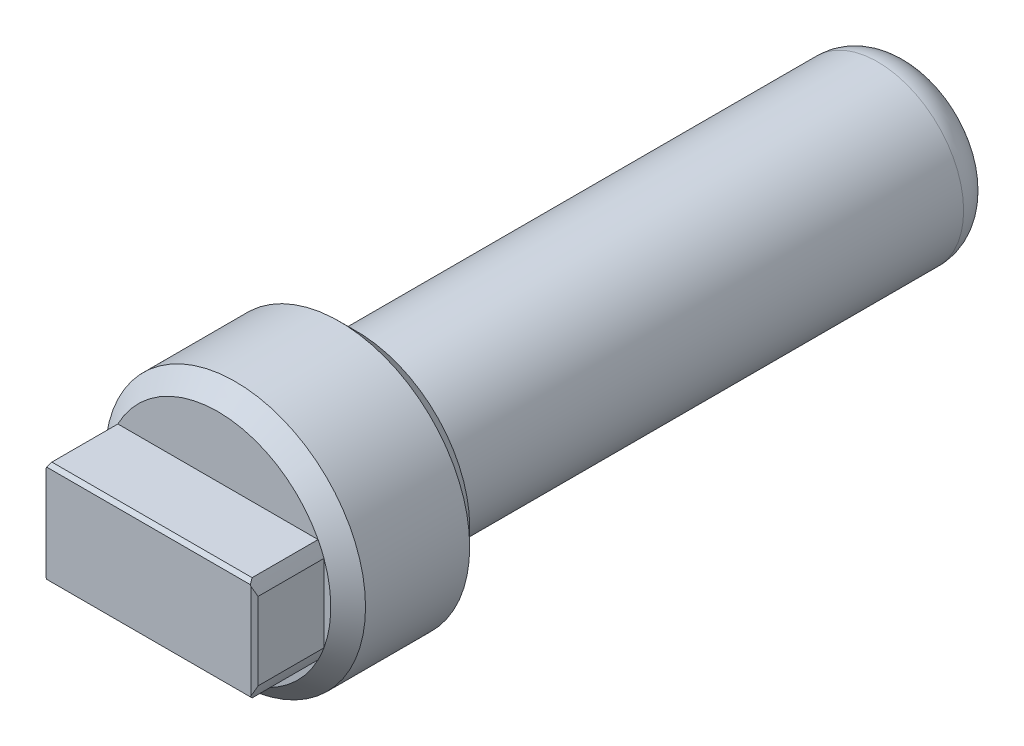
ISO-10303-21;
HEADER;
FILE_DESCRIPTION(('STEP AP214'),'2;1');
FILE_NAME('part.step','',(''),(''),'','','');
FILE_SCHEMA(('AUTOMOTIVE_DESIGN { 1 0 10303 214 1 1 1 1 }'));
ENDSEC;
DATA;
#1=APPLICATION_CONTEXT('core data for automotive mechanical design processes');
#2=APPLICATION_PROTOCOL_DEFINITION('international standard','automotive_design',2000,#1);
#3=PRODUCT_CONTEXT('',#1,'mechanical');
#4=PRODUCT('Part','Part','',(#3));
#5=PRODUCT_RELATED_PRODUCT_CATEGORY('part','',(#4));
#6=PRODUCT_DEFINITION_FORMATION('','',#4);
#7=PRODUCT_DEFINITION_CONTEXT('part definition',#1,'design');
#8=PRODUCT_DEFINITION('design','',#6,#7);
#9=PRODUCT_DEFINITION_SHAPE('','',#8);
#10=(LENGTH_UNIT() NAMED_UNIT(*) SI_UNIT(.MILLI.,.METRE.));
#11=(NAMED_UNIT(*) PLANE_ANGLE_UNIT() SI_UNIT($,.RADIAN.));
#12=(NAMED_UNIT(*) SI_UNIT($,.STERADIAN.) SOLID_ANGLE_UNIT());
#13=UNCERTAINTY_MEASURE_WITH_UNIT(LENGTH_MEASURE(1.E-05),#10,'distance_accuracy_value','');
#14=(GEOMETRIC_REPRESENTATION_CONTEXT(3) GLOBAL_UNCERTAINTY_ASSIGNED_CONTEXT((#13)) GLOBAL_UNIT_ASSIGNED_CONTEXT((#10,
#11,#12)) REPRESENTATION_CONTEXT('',''));
#15=CARTESIAN_POINT('',(0.,0.,0.));
#16=DIRECTION('',(0.,0.,1.));
#17=DIRECTION('',(1.,0.,0.));
#18=AXIS2_PLACEMENT_3D('',#15,#16,#17);
#19=CARTESIAN_POINT('',(0.,0.,20.));
#20=DIRECTION('',(0.,0.,1.));
#21=DIRECTION('',(1.,0.,0.));
#22=AXIS2_PLACEMENT_3D('',#19,#20,#21);
#23=PLANE('',#22);
#24=CARTESIAN_POINT('',(0.,0.,20.));
#25=DIRECTION('',(0.,0.,1.));
#26=DIRECTION('',(1.,0.,0.));
#27=AXIS2_PLACEMENT_3D('',#24,#25,#26);
#28=CIRCLE('',#27,3.24999999999999);
#29=CARTESIAN_POINT('',(-3.05263006031999,1.11532493688194,20.));
#30=VERTEX_POINT('',#29);
#31=CARTESIAN_POINT('',(-3.05263006031999,-1.11532493688194,20.));
#32=VERTEX_POINT('',#31);
#33=EDGE_CURVE('E230',#30,#32,#28,.T.);
#34=ORIENTED_EDGE('',*,*,#33,.T.);
#35=DIRECTION('',(0.,1.,0.));
#36=VECTOR('',#35,1.);
#37=CARTESIAN_POINT('',(-3.05263006031999,0.,20.));
#38=LINE('',#37,#36);
#39=EDGE_CURVE('E330',#32,#30,#38,.T.);
#40=ORIENTED_EDGE('',*,*,#39,.T.);
#41=EDGE_LOOP('',(#34,#40));
#42=FACE_BOUND('',#41,.T.);
#43=ADVANCED_FACE('F35',(#42),#23,.T.);
#44=CARTESIAN_POINT('',(2.88314064866769,1.5,20.));
#45=VERTEX_POINT('',#44);
#46=CARTESIAN_POINT('',(-2.88314064866769,1.5,20.));
#47=VERTEX_POINT('',#46);
#48=EDGE_CURVE('E149',#45,#47,#28,.T.);
#49=ORIENTED_EDGE('',*,*,#48,.T.);
#50=DIRECTION('',(1.,0.,0.));
#51=VECTOR('',#50,1.);
#52=CARTESIAN_POINT('',(0.,1.5,20.));
#53=LINE('',#52,#51);
#54=EDGE_CURVE('E161',#47,#45,#53,.T.);
#55=ORIENTED_EDGE('',*,*,#54,.T.);
#56=EDGE_LOOP('',(#49,#55));
#57=FACE_BOUND('',#56,.T.);
#58=ADVANCED_FACE('F242',(#57),#23,.T.);
#59=DIRECTION('',(1.,0.,0.));
#60=VECTOR('',#59,1.);
#61=CARTESIAN_POINT('',(0.,-1.5,20.));
#62=LINE('',#61,#60);
#63=CARTESIAN_POINT('',(-2.88314064866769,-1.5,20.));
#64=VERTEX_POINT('',#63);
#65=CARTESIAN_POINT('',(2.88314064866769,-1.5,20.));
#66=VERTEX_POINT('',#65);
#67=EDGE_CURVE('E205',#64,#66,#62,.T.);
#68=ORIENTED_EDGE('',*,*,#67,.F.);
#69=EDGE_CURVE('E156',#64,#66,#28,.T.);
#70=ORIENTED_EDGE('',*,*,#69,.T.);
#71=EDGE_LOOP('',(#68,#70));
#72=FACE_BOUND('',#71,.T.);
#73=ADVANCED_FACE('F306',(#72),#23,.T.);
#74=CARTESIAN_POINT('',(0.,0.,16.));
#75=DIRECTION('',(0.,0.,-1.));
#76=DIRECTION('',(-1.,0.,0.));
#77=AXIS2_PLACEMENT_3D('',#74,#75,#76);
#78=CYLINDRICAL_SURFACE('',#77,2.475);
#79=CARTESIAN_POINT('',(0.,0.,1.));
#80=DIRECTION('',(0.,0.,1.));
#81=DIRECTION('',(1.,0.,0.));
#82=AXIS2_PLACEMENT_3D('',#79,#80,#81);
#83=CIRCLE('',#82,2.475);
#84=CARTESIAN_POINT('',(2.475,0.,1.));
#85=VERTEX_POINT('',#84);
#86=EDGE_CURVE('E43',#85,#85,#83,.T.);
#87=ORIENTED_EDGE('',*,*,#86,.T.);
#88=EDGE_LOOP('',(#87));
#89=FACE_BOUND('',#88,.T.);
#90=CARTESIAN_POINT('',(0.,0.,16.));
#91=DIRECTION('',(0.,0.,1.));
#92=DIRECTION('',(1.,0.,0.));
#93=AXIS2_PLACEMENT_3D('',#90,#91,#92);
#94=CIRCLE('',#93,2.475);
#95=CARTESIAN_POINT('',(2.475,0.,16.));
#96=VERTEX_POINT('',#95);
#97=EDGE_CURVE('E201',#96,#96,#94,.T.);
#98=ORIENTED_EDGE('',*,*,#97,.F.);
#99=EDGE_LOOP('',(#98));
#100=FACE_BOUND('',#99,.T.);
#101=ADVANCED_FACE('F291',(#89,#100),#78,.T.);
#102=CARTESIAN_POINT('',(0.,0.,0.));
#103=DIRECTION('',(0.,0.,1.));
#104=DIRECTION('',(1.,0.,0.));
#105=AXIS2_PLACEMENT_3D('',#102,#103,#104);
#106=PLANE('',#105);
#107=CARTESIAN_POINT('',(0.,0.,0.));
#108=DIRECTION('',(0.,0.,1.));
#109=DIRECTION('',(1.,0.,0.));
#110=AXIS2_PLACEMENT_3D('',#107,#108,#109);
#111=CIRCLE('',#110,1.475);
#112=CARTESIAN_POINT('',(1.475,0.,0.));
#113=VERTEX_POINT('',#112);
#114=EDGE_CURVE('E11',#113,#113,#111,.F.);
#115=ORIENTED_EDGE('',*,*,#114,.T.);
#116=EDGE_LOOP('',(#115));
#117=FACE_BOUND('',#116,.T.);
#118=ADVANCED_FACE('F318',(#117),#106,.F.);
#119=CARTESIAN_POINT('',(0.,0.,20.));
#120=DIRECTION('',(0.,0.,-1.));
#121=DIRECTION('',(-1.,0.,0.));
#122=AXIS2_PLACEMENT_3D('',#119,#120,#121);
#123=CYLINDRICAL_SURFACE('',#122,3.75);
#124=CARTESIAN_POINT('',(0.,0.,16.5));
#125=DIRECTION('',(0.,0.,1.));
#126=DIRECTION('',(1.,0.,0.));
#127=AXIS2_PLACEMENT_3D('',#124,#125,#126);
#128=CIRCLE('',#127,3.75);
#129=CARTESIAN_POINT('',(3.75,0.,16.5));
#130=VERTEX_POINT('',#129);
#131=EDGE_CURVE('E219',#130,#130,#128,.T.);
#132=ORIENTED_EDGE('',*,*,#131,.T.);
#133=EDGE_LOOP('',(#132));
#134=FACE_BOUND('',#133,.T.);
#135=CARTESIAN_POINT('',(0.,0.,19.5));
#136=DIRECTION('',(0.,0.,1.));
#137=DIRECTION('',(1.,0.,0.));
#138=AXIS2_PLACEMENT_3D('',#135,#136,#137);
#139=CIRCLE('',#138,3.75);
#140=CARTESIAN_POINT('',(3.75,0.,19.5));
#141=VERTEX_POINT('',#140);
#142=EDGE_CURVE('E216',#141,#141,#139,.F.);
#143=ORIENTED_EDGE('',*,*,#142,.T.);
#144=EDGE_LOOP('',(#143));
#145=FACE_BOUND('',#144,.T.);
#146=ADVANCED_FACE('F311',(#134,#145),#123,.T.);
#147=DIRECTION('',(0.,1.,0.));
#148=VECTOR('',#147,1.);
#149=CARTESIAN_POINT('',(3.05263006031999,0.,20.));
#150=LINE('',#149,#148);
#151=CARTESIAN_POINT('',(3.05263006031999,-1.11532493688194,20.));
#152=VERTEX_POINT('',#151);
#153=CARTESIAN_POINT('',(3.05263006031999,1.11532493688194,20.));
#154=VERTEX_POINT('',#153);
#155=EDGE_CURVE('E155',#152,#154,#150,.T.);
#156=ORIENTED_EDGE('',*,*,#155,.F.);
#157=EDGE_CURVE('E145',#152,#154,#28,.T.);
#158=ORIENTED_EDGE('',*,*,#157,.T.);
#159=EDGE_LOOP('',(#156,#158));
#160=FACE_BOUND('',#159,.T.);
#161=ADVANCED_FACE('F154',(#160),#23,.T.);
#162=CARTESIAN_POINT('',(0.,0.,16.));
#163=DIRECTION('',(0.,0.,1.));
#164=DIRECTION('',(1.,0.,0.));
#165=AXIS2_PLACEMENT_3D('',#162,#163,#164);
#166=PLANE('',#165);
#167=CARTESIAN_POINT('',(0.,0.,16.));
#168=DIRECTION('',(0.,0.,1.));
#169=DIRECTION('',(1.,0.,0.));
#170=AXIS2_PLACEMENT_3D('',#167,#168,#169);
#171=CIRCLE('',#170,3.24999999999999);
#172=CARTESIAN_POINT('',(3.24999999999999,0.,16.));
#173=VERTEX_POINT('',#172);
#174=EDGE_CURVE('E157',#173,#173,#171,.F.);
#175=ORIENTED_EDGE('',*,*,#174,.T.);
#176=EDGE_LOOP('',(#175));
#177=FACE_BOUND('',#176,.T.);
#178=ORIENTED_EDGE('',*,*,#97,.T.);
#179=EDGE_LOOP('',(#178));
#180=FACE_BOUND('',#179,.T.);
#181=ADVANCED_FACE('F310',(#177,#180),#166,.F.);
#182=CARTESIAN_POINT('',(0.,0.,16.5));
#183=DIRECTION('',(0.,0.,1.));
#184=DIRECTION('',(1.,0.,0.));
#185=AXIS2_PLACEMENT_3D('',#182,#183,#184);
#186=CONICAL_SURFACE('',#185,3.75,0.785398163397454);
#187=ORIENTED_EDGE('',*,*,#174,.F.);
#188=EDGE_LOOP('',(#187));
#189=FACE_BOUND('',#188,.T.);
#190=ORIENTED_EDGE('',*,*,#131,.F.);
#191=EDGE_LOOP('',(#190));
#192=FACE_BOUND('',#191,.T.);
#193=ADVANCED_FACE('F316',(#189,#192),#186,.T.);
#194=CARTESIAN_POINT('',(0.,0.,20.));
#195=DIRECTION('',(0.,0.,-1.));
#196=DIRECTION('',(-1.,0.,0.));
#197=AXIS2_PLACEMENT_3D('',#194,#195,#196);
#198=CONICAL_SURFACE('',#197,3.24999999999999,0.785398163397449);
#199=ORIENTED_EDGE('',*,*,#142,.F.);
#200=EDGE_LOOP('',(#199));
#201=FACE_BOUND('',#200,.T.);
#202=EDGE_CURVE('E131',#154,#45,#28,.T.);
#203=ORIENTED_EDGE('',*,*,#202,.F.);
#204=ORIENTED_EDGE('',*,*,#157,.F.);
#205=CARTESIAN_POINT('',(0.,0.,20.));
#206=DIRECTION('',(0.,0.,1.));
#207=DIRECTION('',(1.,0.,0.));
#208=AXIS2_PLACEMENT_3D('',#205,#206,#207);
#209=CIRCLE('',#208,3.24999999999999);
#210=EDGE_CURVE('E162',#66,#152,#209,.T.);
#211=ORIENTED_EDGE('',*,*,#210,.F.);
#212=ORIENTED_EDGE('',*,*,#69,.F.);
#213=EDGE_CURVE('E209',#32,#64,#209,.T.);
#214=ORIENTED_EDGE('',*,*,#213,.F.);
#215=ORIENTED_EDGE('',*,*,#33,.F.);
#216=EDGE_CURVE('E165',#47,#30,#209,.T.);
#217=ORIENTED_EDGE('',*,*,#216,.F.);
#218=ORIENTED_EDGE('',*,*,#48,.F.);
#219=EDGE_LOOP('',(#203,#204,#211,#212,#214,#215,#217,#218));
#220=FACE_BOUND('',#219,.T.);
#221=ADVANCED_FACE('F143',(#201,#220),#198,.T.);
#222=CARTESIAN_POINT('',(0.,0.,22.));
#223=DIRECTION('',(0.,0.,-1.));
#224=DIRECTION('',(-1.,0.,0.));
#225=AXIS2_PLACEMENT_3D('',#222,#223,#224);
#226=CYLINDRICAL_SURFACE('',#225,3.24999999999999);
#227=DIRECTION('',(0.,0.,-1.));
#228=VECTOR('',#227,1.);
#229=CARTESIAN_POINT('',(3.05263006031999,-1.11532493688194,22.));
#230=LINE('',#229,#228);
#231=CARTESIAN_POINT('',(3.05263006031999,-1.11532493688194,21.9));
#232=VERTEX_POINT('',#231);
#233=EDGE_CURVE('E136',#232,#152,#230,.T.);
#234=ORIENTED_EDGE('',*,*,#233,.F.);
#235=CARTESIAN_POINT('',(0.,0.,24.9526300603199));
#236=DIRECTION('',(0.707106781186535,0.,0.70710678118656));
#237=DIRECTION('',(0.70710678118656,0.,-0.707106781186535));
#238=AXIS2_PLACEMENT_3D('',#235,#236,#237);
#239=ELLIPSE('',#238,4.59619407771247,3.24999999999999);
#240=CARTESIAN_POINT('',(2.95263006031999,-1.3581147694119,22.));
#241=VERTEX_POINT('',#240);
#242=EDGE_CURVE('E342',#232,#241,#239,.F.);
#243=ORIENTED_EDGE('',*,*,#242,.T.);
#244=CARTESIAN_POINT('',(0.,0.,22.));
#245=DIRECTION('',(0.,0.,1.));
#246=DIRECTION('',(1.,0.,0.));
#247=AXIS2_PLACEMENT_3D('',#244,#245,#246);
#248=CIRCLE('',#247,3.24999999999999);
#249=CARTESIAN_POINT('',(2.93300187521249,-1.39999999999999,22.));
#250=VERTEX_POINT('',#249);
#251=EDGE_CURVE('E208',#250,#241,#248,.T.);
#252=ORIENTED_EDGE('',*,*,#251,.F.);
#253=CARTESIAN_POINT('',(0.,0.,23.3999999999999));
#254=DIRECTION('',(0.,-0.707106781186535,0.70710678118656));
#255=DIRECTION('',(0.,-0.70710678118656,-0.707106781186535));
#256=AXIS2_PLACEMENT_3D('',#253,#254,#255);
#257=ELLIPSE('',#256,4.59619407771247,3.24999999999999);
#258=CARTESIAN_POINT('',(2.88314064866769,-1.5,21.9));
#259=VERTEX_POINT('',#258);
#260=EDGE_CURVE('E378',#250,#259,#257,.F.);
#261=ORIENTED_EDGE('',*,*,#260,.T.);
#262=DIRECTION('',(0.,0.,-1.));
#263=VECTOR('',#262,1.);
#264=CARTESIAN_POINT('',(2.88314064866769,-1.5,22.));
#265=LINE('',#264,#263);
#266=EDGE_CURVE('E277',#259,#66,#265,.T.);
#267=ORIENTED_EDGE('',*,*,#266,.T.);
#268=ORIENTED_EDGE('',*,*,#210,.T.);
#269=EDGE_LOOP('',(#234,#243,#252,#261,#267,#268));
#270=FACE_BOUND('',#269,.T.);
#271=ADVANCED_FACE('F360',(#270),#226,.T.);
#272=CARTESIAN_POINT('',(3.05263006031999,0.,22.));
#273=DIRECTION('',(-1.,0.,0.));
#274=DIRECTION('',(0.,0.,1.));
#275=AXIS2_PLACEMENT_3D('',#272,#273,#274);
#276=PLANE('',#275);
#277=DIRECTION('',(0.,0.,-1.));
#278=VECTOR('',#277,1.);
#279=CARTESIAN_POINT('',(3.05263006031999,1.11532493688194,22.));
#280=LINE('',#279,#278);
#281=CARTESIAN_POINT('',(3.05263006031999,1.11532493688194,21.9));
#282=VERTEX_POINT('',#281);
#283=EDGE_CURVE('E126',#282,#154,#280,.T.);
#284=ORIENTED_EDGE('',*,*,#283,.F.);
#285=DIRECTION('',(0.,-1.,0.));
#286=VECTOR('',#285,1.);
#287=CARTESIAN_POINT('',(3.05263006031999,-1.11532493688194,21.9));
#288=LINE('',#287,#286);
#289=EDGE_CURVE('E199',#282,#232,#288,.T.);
#290=ORIENTED_EDGE('',*,*,#289,.T.);
#291=ORIENTED_EDGE('',*,*,#233,.T.);
#292=ORIENTED_EDGE('',*,*,#155,.T.);
#293=EDGE_LOOP('',(#284,#290,#291,#292));
#294=FACE_BOUND('',#293,.T.);
#295=ADVANCED_FACE('F159',(#294),#276,.F.);
#296=CARTESIAN_POINT('',(2.95263006031999,1.3581147694119,22.));
#297=VERTEX_POINT('',#296);
#298=CARTESIAN_POINT('',(2.93300187521249,1.39999999999999,22.));
#299=VERTEX_POINT('',#298);
#300=EDGE_CURVE('E249',#297,#299,#248,.T.);
#301=ORIENTED_EDGE('',*,*,#300,.F.);
#302=CARTESIAN_POINT('',(0.,0.,24.9526300603199));
#303=DIRECTION('',(0.707106781186535,0.,0.70710678118656));
#304=DIRECTION('',(0.70710678118656,0.,-0.707106781186535));
#305=AXIS2_PLACEMENT_3D('',#302,#303,#304);
#306=ELLIPSE('',#305,4.59619407771247,3.24999999999999);
#307=EDGE_CURVE('E132',#297,#282,#306,.F.);
#308=ORIENTED_EDGE('',*,*,#307,.T.);
#309=ORIENTED_EDGE('',*,*,#283,.T.);
#310=ORIENTED_EDGE('',*,*,#202,.T.);
#311=DIRECTION('',(0.,0.,-1.));
#312=VECTOR('',#311,1.);
#313=CARTESIAN_POINT('',(2.88314064866769,1.5,22.));
#314=LINE('',#313,#312);
#315=CARTESIAN_POINT('',(2.88314064866769,1.5,21.9));
#316=VERTEX_POINT('',#315);
#317=EDGE_CURVE('E137',#316,#45,#314,.T.);
#318=ORIENTED_EDGE('',*,*,#317,.F.);
#319=CARTESIAN_POINT('',(0.,0.,23.4));
#320=DIRECTION('',(0.,-0.707106781186547,-0.707106781186547));
#321=DIRECTION('',(0.,0.707106781186548,-0.707106781186548));
#322=AXIS2_PLACEMENT_3D('',#319,#320,#321);
#323=ELLIPSE('',#322,4.59619407771255,3.24999999999999);
#324=EDGE_CURVE('E196',#316,#299,#323,.T.);
#325=ORIENTED_EDGE('',*,*,#324,.T.);
#326=EDGE_LOOP('',(#301,#308,#309,#310,#318,#325));
#327=FACE_BOUND('',#326,.T.);
#328=ADVANCED_FACE('F129',(#327),#226,.T.);
#329=CARTESIAN_POINT('',(0.,1.5,22.));
#330=DIRECTION('',(0.,1.,0.));
#331=DIRECTION('',(0.,0.,1.));
#332=AXIS2_PLACEMENT_3D('',#329,#330,#331);
#333=PLANE('',#332);
#334=DIRECTION('',(0.,0.,-1.));
#335=VECTOR('',#334,1.);
#336=CARTESIAN_POINT('',(-2.88314064866769,1.5,22.));
#337=LINE('',#336,#335);
#338=CARTESIAN_POINT('',(-2.88314064866769,1.5,21.9));
#339=VERTEX_POINT('',#338);
#340=EDGE_CURVE('E192',#339,#47,#337,.T.);
#341=ORIENTED_EDGE('',*,*,#340,.F.);
#342=DIRECTION('',(1.,0.,0.));
#343=VECTOR('',#342,1.);
#344=CARTESIAN_POINT('',(0.,1.5,21.9));
#345=LINE('',#344,#343);
#346=EDGE_CURVE('E247',#339,#316,#345,.T.);
#347=ORIENTED_EDGE('',*,*,#346,.T.);
#348=ORIENTED_EDGE('',*,*,#317,.T.);
#349=ORIENTED_EDGE('',*,*,#54,.F.);
#350=EDGE_LOOP('',(#341,#347,#348,#349));
#351=FACE_BOUND('',#350,.T.);
#352=ADVANCED_FACE('F244',(#351),#333,.T.);
#353=DIRECTION('',(0.,0.,-1.));
#354=VECTOR('',#353,1.);
#355=CARTESIAN_POINT('',(-3.05263006031999,1.11532493688194,22.));
#356=LINE('',#355,#354);
#357=CARTESIAN_POINT('',(-3.05263006031999,1.11532493688194,21.9));
#358=VERTEX_POINT('',#357);
#359=EDGE_CURVE('E340',#358,#30,#356,.T.);
#360=ORIENTED_EDGE('',*,*,#359,.F.);
#361=CARTESIAN_POINT('',(0.,0.,24.9526300603201));
#362=DIRECTION('',(0.70710678118656,0.,-0.707106781186535));
#363=DIRECTION('',(-0.707106781186535,0.,-0.70710678118656));
#364=AXIS2_PLACEMENT_3D('',#361,#362,#363);
#365=ELLIPSE('',#364,4.59619407771263,3.24999999999999);
#366=CARTESIAN_POINT('',(-2.95263006031999,1.35811476941189,22.));
#367=VERTEX_POINT('',#366);
#368=EDGE_CURVE('E284',#358,#367,#365,.T.);
#369=ORIENTED_EDGE('',*,*,#368,.T.);
#370=CARTESIAN_POINT('',(-2.93300187521249,1.4,22.));
#371=VERTEX_POINT('',#370);
#372=EDGE_CURVE('E258',#371,#367,#248,.T.);
#373=ORIENTED_EDGE('',*,*,#372,.F.);
#374=CARTESIAN_POINT('',(0.,0.,23.4));
#375=DIRECTION('',(0.,-0.707106781186547,-0.707106781186547));
#376=DIRECTION('',(0.,0.707106781186548,-0.707106781186548));
#377=AXIS2_PLACEMENT_3D('',#374,#375,#376);
#378=ELLIPSE('',#377,4.59619407771255,3.24999999999999);
#379=EDGE_CURVE('E58',#371,#339,#378,.T.);
#380=ORIENTED_EDGE('',*,*,#379,.T.);
#381=ORIENTED_EDGE('',*,*,#340,.T.);
#382=ORIENTED_EDGE('',*,*,#216,.T.);
#383=EDGE_LOOP('',(#360,#369,#373,#380,#381,#382));
#384=FACE_BOUND('',#383,.T.);
#385=ADVANCED_FACE('F349',(#384),#226,.T.);
#386=CARTESIAN_POINT('',(-3.05263006031999,0.,22.));
#387=DIRECTION('',(-1.,0.,0.));
#388=DIRECTION('',(0.,0.,1.));
#389=AXIS2_PLACEMENT_3D('',#386,#387,#388);
#390=PLANE('',#389);
#391=DIRECTION('',(0.,0.,-1.));
#392=VECTOR('',#391,1.);
#393=CARTESIAN_POINT('',(-3.05263006031999,-1.11532493688194,22.));
#394=LINE('',#393,#392);
#395=CARTESIAN_POINT('',(-3.05263006031999,-1.11532493688194,21.9));
#396=VERTEX_POINT('',#395);
#397=EDGE_CURVE('E329',#396,#32,#394,.T.);
#398=ORIENTED_EDGE('',*,*,#397,.F.);
#399=DIRECTION('',(0.,1.,0.));
#400=VECTOR('',#399,1.);
#401=CARTESIAN_POINT('',(-3.05263006031999,0.,21.9));
#402=LINE('',#401,#400);
#403=EDGE_CURVE('E281',#396,#358,#402,.T.);
#404=ORIENTED_EDGE('',*,*,#403,.T.);
#405=ORIENTED_EDGE('',*,*,#359,.T.);
#406=ORIENTED_EDGE('',*,*,#39,.F.);
#407=EDGE_LOOP('',(#398,#404,#405,#406));
#408=FACE_BOUND('',#407,.T.);
#409=ADVANCED_FACE('F351',(#408),#390,.T.);
#410=CARTESIAN_POINT('',(-2.95263006031999,-1.35811476941189,22.));
#411=VERTEX_POINT('',#410);
#412=CARTESIAN_POINT('',(-2.93300187521249,-1.39999999999999,22.));
#413=VERTEX_POINT('',#412);
#414=EDGE_CURVE('E268',#411,#413,#248,.T.);
#415=ORIENTED_EDGE('',*,*,#414,.F.);
#416=CARTESIAN_POINT('',(0.,0.,24.9526300603201));
#417=DIRECTION('',(0.70710678118656,0.,-0.707106781186535));
#418=DIRECTION('',(-0.707106781186535,0.,-0.70710678118656));
#419=AXIS2_PLACEMENT_3D('',#416,#417,#418);
#420=ELLIPSE('',#419,4.59619407771263,3.24999999999999);
#421=EDGE_CURVE('E273',#411,#396,#420,.T.);
#422=ORIENTED_EDGE('',*,*,#421,.T.);
#423=ORIENTED_EDGE('',*,*,#397,.T.);
#424=ORIENTED_EDGE('',*,*,#213,.T.);
#425=DIRECTION('',(0.,0.,-1.));
#426=VECTOR('',#425,1.);
#427=CARTESIAN_POINT('',(-2.88314064866769,-1.5,22.));
#428=LINE('',#427,#426);
#429=CARTESIAN_POINT('',(-2.88314064866769,-1.5,21.9));
#430=VERTEX_POINT('',#429);
#431=EDGE_CURVE('E328',#430,#64,#428,.T.);
#432=ORIENTED_EDGE('',*,*,#431,.F.);
#433=CARTESIAN_POINT('',(0.,0.,23.3999999999999));
#434=DIRECTION('',(0.,-0.707106781186535,0.70710678118656));
#435=DIRECTION('',(0.,-0.70710678118656,-0.707106781186535));
#436=AXIS2_PLACEMENT_3D('',#433,#434,#435);
#437=ELLIPSE('',#436,4.59619407771247,3.24999999999999);
#438=EDGE_CURVE('E276',#430,#413,#437,.F.);
#439=ORIENTED_EDGE('',*,*,#438,.T.);
#440=EDGE_LOOP('',(#415,#422,#423,#424,#432,#439));
#441=FACE_BOUND('',#440,.T.);
#442=ADVANCED_FACE('F272',(#441),#226,.T.);
#443=CARTESIAN_POINT('',(0.,-1.5,22.));
#444=DIRECTION('',(0.,1.,0.));
#445=DIRECTION('',(0.,0.,1.));
#446=AXIS2_PLACEMENT_3D('',#443,#444,#445);
#447=PLANE('',#446);
#448=ORIENTED_EDGE('',*,*,#266,.F.);
#449=DIRECTION('',(-1.,0.,0.));
#450=VECTOR('',#449,1.);
#451=CARTESIAN_POINT('',(-2.88314064866769,-1.5,21.9));
#452=LINE('',#451,#450);
#453=EDGE_CURVE('E50',#259,#430,#452,.T.);
#454=ORIENTED_EDGE('',*,*,#453,.T.);
#455=ORIENTED_EDGE('',*,*,#431,.T.);
#456=ORIENTED_EDGE('',*,*,#67,.T.);
#457=EDGE_LOOP('',(#448,#454,#455,#456));
#458=FACE_BOUND('',#457,.T.);
#459=ADVANCED_FACE('F358',(#458),#447,.F.);
#460=CARTESIAN_POINT('',(0.,0.,22.));
#461=DIRECTION('',(0.,0.,1.));
#462=DIRECTION('',(1.,0.,0.));
#463=AXIS2_PLACEMENT_3D('',#460,#461,#462);
#464=PLANE('',#463);
#465=ORIENTED_EDGE('',*,*,#251,.T.);
#466=DIRECTION('',(0.,1.,0.));
#467=VECTOR('',#466,1.);
#468=CARTESIAN_POINT('',(2.95263006031999,1.11532493688194,22.));
#469=LINE('',#468,#467);
#470=EDGE_CURVE('E193',#241,#297,#469,.T.);
#471=ORIENTED_EDGE('',*,*,#470,.T.);
#472=ORIENTED_EDGE('',*,*,#300,.T.);
#473=DIRECTION('',(-1.,0.,0.));
#474=VECTOR('',#473,1.);
#475=CARTESIAN_POINT('',(0.,1.39999999999999,22.));
#476=LINE('',#475,#474);
#477=EDGE_CURVE('E150',#299,#371,#476,.T.);
#478=ORIENTED_EDGE('',*,*,#477,.T.);
#479=ORIENTED_EDGE('',*,*,#372,.T.);
#480=DIRECTION('',(0.,-1.,0.));
#481=VECTOR('',#480,1.);
#482=CARTESIAN_POINT('',(-2.95263006031999,0.,22.));
#483=LINE('',#482,#481);
#484=EDGE_CURVE('E262',#367,#411,#483,.T.);
#485=ORIENTED_EDGE('',*,*,#484,.T.);
#486=ORIENTED_EDGE('',*,*,#414,.T.);
#487=DIRECTION('',(1.,0.,0.));
#488=VECTOR('',#487,1.);
#489=CARTESIAN_POINT('',(2.88314064866769,-1.39999999999999,22.));
#490=LINE('',#489,#488);
#491=EDGE_CURVE('E260',#413,#250,#490,.T.);
#492=ORIENTED_EDGE('',*,*,#491,.T.);
#493=EDGE_LOOP('',(#465,#471,#472,#478,#479,#485,#486,#492));
#494=FACE_BOUND('',#493,.T.);
#495=ADVANCED_FACE('F255',(#494),#464,.T.);
#496=CARTESIAN_POINT('',(2.95263006031999,0.,22.));
#497=DIRECTION('',(0.707106781186535,0.,0.70710678118656));
#498=DIRECTION('',(0.,-1.,0.));
#499=AXIS2_PLACEMENT_3D('',#496,#497,#498);
#500=PLANE('',#499);
#501=ORIENTED_EDGE('',*,*,#242,.F.);
#502=ORIENTED_EDGE('',*,*,#289,.F.);
#503=ORIENTED_EDGE('',*,*,#307,.F.);
#504=ORIENTED_EDGE('',*,*,#470,.F.);
#505=EDGE_LOOP('',(#501,#502,#503,#504));
#506=FACE_BOUND('',#505,.T.);
#507=ADVANCED_FACE('F377',(#506),#500,.T.);
#508=CARTESIAN_POINT('',(-3.05263006031999,0.,21.9));
#509=DIRECTION('',(0.70710678118656,0.,-0.707106781186535));
#510=DIRECTION('',(0.,1.,0.));
#511=AXIS2_PLACEMENT_3D('',#508,#509,#510);
#512=PLANE('',#511);
#513=ORIENTED_EDGE('',*,*,#421,.F.);
#514=ORIENTED_EDGE('',*,*,#484,.F.);
#515=ORIENTED_EDGE('',*,*,#368,.F.);
#516=ORIENTED_EDGE('',*,*,#403,.F.);
#517=EDGE_LOOP('',(#513,#514,#515,#516));
#518=FACE_BOUND('',#517,.T.);
#519=ADVANCED_FACE('F279',(#518),#512,.F.);
#520=CARTESIAN_POINT('',(0.,-1.39999999999999,22.));
#521=DIRECTION('',(0.,-0.707106781186535,0.70710678118656));
#522=DIRECTION('',(-1.,0.,0.));
#523=AXIS2_PLACEMENT_3D('',#520,#521,#522);
#524=PLANE('',#523);
#525=ORIENTED_EDGE('',*,*,#438,.F.);
#526=ORIENTED_EDGE('',*,*,#453,.F.);
#527=ORIENTED_EDGE('',*,*,#260,.F.);
#528=ORIENTED_EDGE('',*,*,#491,.F.);
#529=EDGE_LOOP('',(#525,#526,#527,#528));
#530=FACE_BOUND('',#529,.T.);
#531=ADVANCED_FACE('F299',(#530),#524,.T.);
#532=CARTESIAN_POINT('',(0.,1.5,21.9));
#533=DIRECTION('',(0.,-0.707106781186547,-0.707106781186547));
#534=DIRECTION('',(1.,0.,0.));
#535=AXIS2_PLACEMENT_3D('',#532,#533,#534);
#536=PLANE('',#535);
#537=ORIENTED_EDGE('',*,*,#379,.F.);
#538=ORIENTED_EDGE('',*,*,#477,.F.);
#539=ORIENTED_EDGE('',*,*,#324,.F.);
#540=ORIENTED_EDGE('',*,*,#346,.F.);
#541=EDGE_LOOP('',(#537,#538,#539,#540));
#542=FACE_BOUND('',#541,.T.);
#543=ADVANCED_FACE('F259',(#542),#536,.F.);
#544=CARTESIAN_POINT('',(0.,0.,1.));
#545=DIRECTION('',(0.,0.,1.));
#546=DIRECTION('',(1.,0.,0.));
#547=AXIS2_PLACEMENT_3D('',#544,#545,#546);
#548=TOROIDAL_SURFACE('',#547,1.475,1.);
#549=ORIENTED_EDGE('',*,*,#114,.F.);
#550=EDGE_LOOP('',(#549));
#551=FACE_BOUND('',#550,.T.);
#552=ORIENTED_EDGE('',*,*,#86,.F.);
#553=EDGE_LOOP('',(#552));
#554=FACE_BOUND('',#553,.T.);
#555=ADVANCED_FACE('F37',(#551,#554),#548,.T.);
#556=CLOSED_SHELL('',(#43,#58,#73,#101,#118,#146,#161,#181,#193,#221,#271,#295,#328,#352,#385,
#409,#442,#459,#495,#507,#519,#531,#543,#555));
#557=MANIFOLD_SOLID_BREP('B2',#556);
#558=ADVANCED_BREP_SHAPE_REPRESENTATION('',(#18,#557),#14);
#559=SHAPE_DEFINITION_REPRESENTATION(#9,#558);
ENDSEC;
END-ISO-10303-21;
